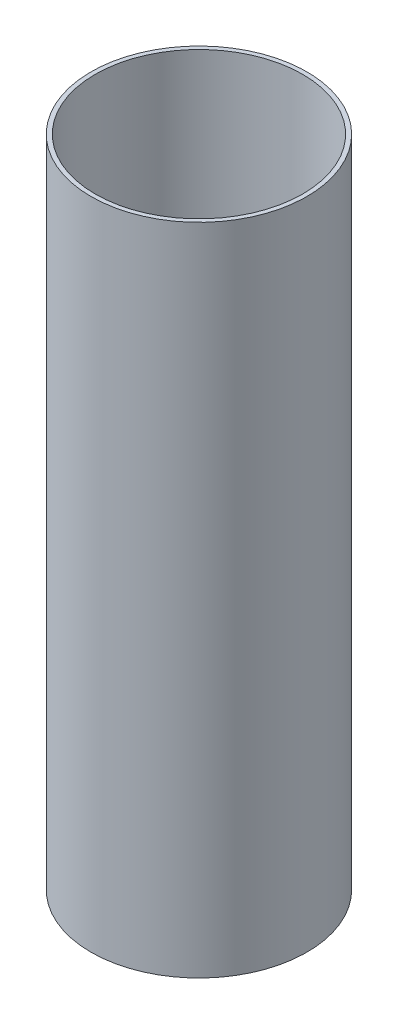
ISO-10303-21;
HEADER;
FILE_DESCRIPTION(('STEP AP214'),'2;1');
FILE_NAME('part.step','',(''),(''),'','','');
FILE_SCHEMA(('AUTOMOTIVE_DESIGN { 1 0 10303 214 1 1 1 1 }'));
ENDSEC;
DATA;
#1=APPLICATION_CONTEXT('core data for automotive mechanical design processes');
#2=APPLICATION_PROTOCOL_DEFINITION('international standard','automotive_design',2000,#1);
#3=PRODUCT_CONTEXT('',#1,'mechanical');
#4=PRODUCT('Part','Part','',(#3));
#5=PRODUCT_RELATED_PRODUCT_CATEGORY('part','',(#4));
#6=PRODUCT_DEFINITION_FORMATION('','',#4);
#7=PRODUCT_DEFINITION_CONTEXT('part definition',#1,'design');
#8=PRODUCT_DEFINITION('design','',#6,#7);
#9=PRODUCT_DEFINITION_SHAPE('','',#8);
#10=(LENGTH_UNIT() NAMED_UNIT(*) SI_UNIT(.MILLI.,.METRE.));
#11=(NAMED_UNIT(*) PLANE_ANGLE_UNIT() SI_UNIT($,.RADIAN.));
#12=(NAMED_UNIT(*) SI_UNIT($,.STERADIAN.) SOLID_ANGLE_UNIT());
#13=UNCERTAINTY_MEASURE_WITH_UNIT(LENGTH_MEASURE(1.E-05),#10,'distance_accuracy_value','');
#14=(GEOMETRIC_REPRESENTATION_CONTEXT(3) GLOBAL_UNCERTAINTY_ASSIGNED_CONTEXT((#13)) GLOBAL_UNIT_ASSIGNED_CONTEXT((#10,
#11,#12)) REPRESENTATION_CONTEXT('',''));
#15=CARTESIAN_POINT('',(0.,0.,0.));
#16=DIRECTION('',(0.,0.,1.));
#17=DIRECTION('',(1.,0.,0.));
#18=AXIS2_PLACEMENT_3D('',#15,#16,#17);
#19=CARTESIAN_POINT('',(0.,-115.,0.));
#20=DIRECTION('',(0.,1.,0.));
#21=DIRECTION('',(0.,0.,1.));
#22=AXIS2_PLACEMENT_3D('',#19,#20,#21);
#23=CYLINDRICAL_SURFACE('',#22,37.95);
#24=CARTESIAN_POINT('',(0.,-115.,0.));
#25=DIRECTION('',(0.,1.,0.));
#26=DIRECTION('',(0.,0.,1.));
#27=AXIS2_PLACEMENT_3D('',#24,#25,#26);
#28=CIRCLE('',#27,37.95);
#29=CARTESIAN_POINT('',(0.,-115.,37.95));
#30=VERTEX_POINT('',#29);
#31=EDGE_CURVE('E10',#30,#30,#28,.T.);
#32=ORIENTED_EDGE('',*,*,#31,.T.);
#33=EDGE_LOOP('',(#32));
#34=FACE_BOUND('',#33,.T.);
#35=CARTESIAN_POINT('',(0.,115.,0.));
#36=DIRECTION('',(0.,1.,0.));
#37=DIRECTION('',(0.,0.,1.));
#38=AXIS2_PLACEMENT_3D('',#35,#36,#37);
#39=CIRCLE('',#38,37.95);
#40=CARTESIAN_POINT('',(0.,115.,37.95));
#41=VERTEX_POINT('',#40);
#42=EDGE_CURVE('E49',#41,#41,#39,.T.);
#43=ORIENTED_EDGE('',*,*,#42,.F.);
#44=EDGE_LOOP('',(#43));
#45=FACE_BOUND('',#44,.T.);
#46=ADVANCED_FACE('F37',(#34,#45),#23,.T.);
#47=CARTESIAN_POINT('',(0.,-115.,0.));
#48=DIRECTION('',(0.,1.,0.));
#49=DIRECTION('',(0.,0.,1.));
#50=AXIS2_PLACEMENT_3D('',#47,#48,#49);
#51=PLANE('',#50);
#52=CARTESIAN_POINT('',(0.,-115.,0.));
#53=DIRECTION('',(0.,1.,0.));
#54=DIRECTION('',(0.,0.,1.));
#55=AXIS2_PLACEMENT_3D('',#52,#53,#54);
#56=CIRCLE('',#55,36.45);
#57=CARTESIAN_POINT('',(0.,-115.,36.45));
#58=VERTEX_POINT('',#57);
#59=EDGE_CURVE('E44',#58,#58,#56,.T.);
#60=ORIENTED_EDGE('',*,*,#59,.T.);
#61=EDGE_LOOP('',(#60));
#62=FACE_BOUND('',#61,.T.);
#63=ORIENTED_EDGE('',*,*,#31,.F.);
#64=EDGE_LOOP('',(#63));
#65=FACE_BOUND('',#64,.T.);
#66=ADVANCED_FACE('F70',(#62,#65),#51,.F.);
#67=CARTESIAN_POINT('',(0.,-115.,0.));
#68=DIRECTION('',(0.,1.,0.));
#69=DIRECTION('',(0.,0.,1.));
#70=AXIS2_PLACEMENT_3D('',#67,#68,#69);
#71=CYLINDRICAL_SURFACE('',#70,36.45);
#72=ORIENTED_EDGE('',*,*,#59,.F.);
#73=EDGE_LOOP('',(#72));
#74=FACE_BOUND('',#73,.T.);
#75=CARTESIAN_POINT('',(0.,115.,0.));
#76=DIRECTION('',(0.,1.,0.));
#77=DIRECTION('',(0.,0.,1.));
#78=AXIS2_PLACEMENT_3D('',#75,#76,#77);
#79=CIRCLE('',#78,36.45);
#80=CARTESIAN_POINT('',(0.,115.,36.45));
#81=VERTEX_POINT('',#80);
#82=EDGE_CURVE('E54',#81,#81,#79,.T.);
#83=ORIENTED_EDGE('',*,*,#82,.T.);
#84=EDGE_LOOP('',(#83));
#85=FACE_BOUND('',#84,.T.);
#86=ADVANCED_FACE('F61',(#74,#85),#71,.F.);
#87=CARTESIAN_POINT('',(0.,115.,0.));
#88=DIRECTION('',(0.,1.,0.));
#89=DIRECTION('',(0.,0.,1.));
#90=AXIS2_PLACEMENT_3D('',#87,#88,#89);
#91=PLANE('',#90);
#92=ORIENTED_EDGE('',*,*,#42,.T.);
#93=EDGE_LOOP('',(#92));
#94=FACE_BOUND('',#93,.T.);
#95=ORIENTED_EDGE('',*,*,#82,.F.);
#96=EDGE_LOOP('',(#95));
#97=FACE_BOUND('',#96,.T.);
#98=ADVANCED_FACE('F63',(#94,#97),#91,.T.);
#99=CLOSED_SHELL('',(#46,#66,#86,#98));
#100=MANIFOLD_SOLID_BREP('B2',#99);
#101=ADVANCED_BREP_SHAPE_REPRESENTATION('',(#18,#100),#14);
#102=SHAPE_DEFINITION_REPRESENTATION(#9,#101);
ENDSEC;
END-ISO-10303-21;
